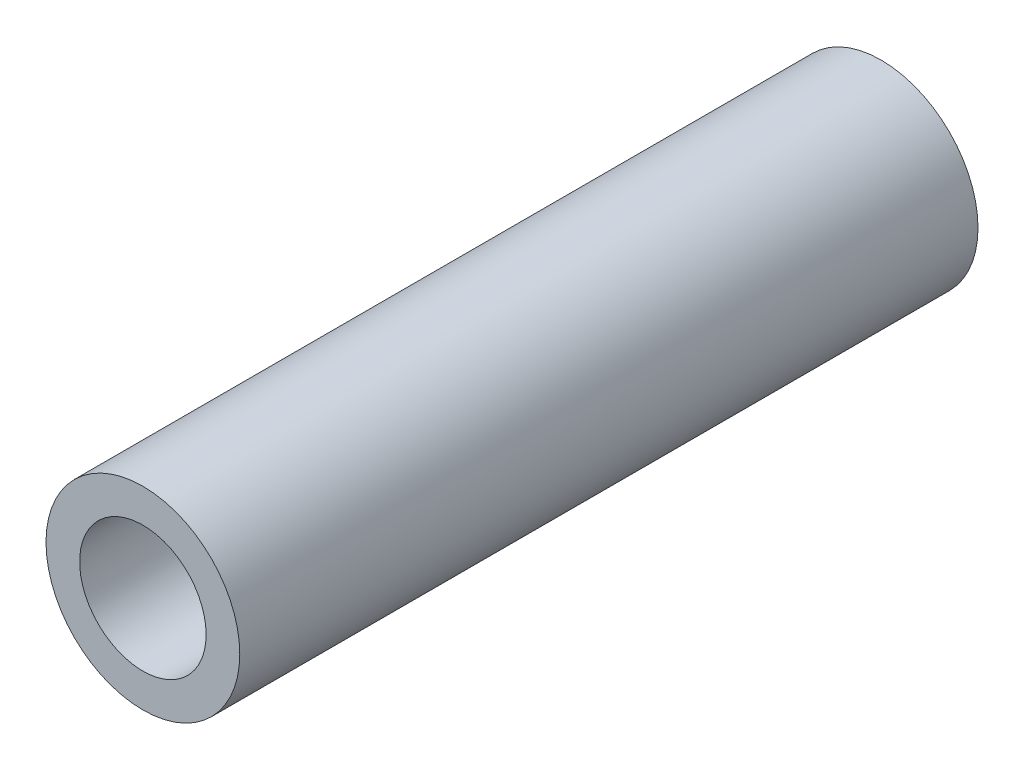
ISO-10303-21;
HEADER;
FILE_DESCRIPTION(('STEP AP214'),'2;1');
FILE_NAME('part.step','',(''),(''),'','','');
FILE_SCHEMA(('AUTOMOTIVE_DESIGN { 1 0 10303 214 1 1 1 1 }'));
ENDSEC;
DATA;
#1=APPLICATION_CONTEXT('core data for automotive mechanical design processes');
#2=APPLICATION_PROTOCOL_DEFINITION('international standard','automotive_design',2000,#1);
#3=PRODUCT_CONTEXT('',#1,'mechanical');
#4=PRODUCT('Part','Part','',(#3));
#5=PRODUCT_RELATED_PRODUCT_CATEGORY('part','',(#4));
#6=PRODUCT_DEFINITION_FORMATION('','',#4);
#7=PRODUCT_DEFINITION_CONTEXT('part definition',#1,'design');
#8=PRODUCT_DEFINITION('design','',#6,#7);
#9=PRODUCT_DEFINITION_SHAPE('','',#8);
#10=(LENGTH_UNIT() NAMED_UNIT(*) SI_UNIT(.MILLI.,.METRE.));
#11=(NAMED_UNIT(*) PLANE_ANGLE_UNIT() SI_UNIT($,.RADIAN.));
#12=(NAMED_UNIT(*) SI_UNIT($,.STERADIAN.) SOLID_ANGLE_UNIT());
#13=UNCERTAINTY_MEASURE_WITH_UNIT(LENGTH_MEASURE(1.E-05),#10,'distance_accuracy_value','');
#14=(GEOMETRIC_REPRESENTATION_CONTEXT(3) GLOBAL_UNCERTAINTY_ASSIGNED_CONTEXT((#13)) GLOBAL_UNIT_ASSIGNED_CONTEXT((#10,
#11,#12)) REPRESENTATION_CONTEXT('',''));
#15=CARTESIAN_POINT('',(0.,0.,0.));
#16=DIRECTION('',(0.,0.,1.));
#17=DIRECTION('',(1.,0.,0.));
#18=AXIS2_PLACEMENT_3D('',#15,#16,#17);
#19=CARTESIAN_POINT('',(0.,0.,19.05));
#20=DIRECTION('',(0.,0.,-1.));
#21=DIRECTION('',(-1.,0.,0.));
#22=AXIS2_PLACEMENT_3D('',#19,#20,#21);
#23=CYLINDRICAL_SURFACE('',#22,2.5);
#24=CARTESIAN_POINT('',(0.,0.,19.05));
#25=DIRECTION('',(0.,0.,1.));
#26=DIRECTION('',(1.,0.,0.));
#27=AXIS2_PLACEMENT_3D('',#24,#25,#26);
#28=CIRCLE('',#27,2.5);
#29=CARTESIAN_POINT('',(-2.5,0.,19.05));
#30=VERTEX_POINT('',#29);
#31=EDGE_CURVE('E10',#30,#30,#28,.T.);
#32=CARTESIAN_POINT('',(0.,0.,0.));
#33=DIRECTION('',(0.,0.,1.));
#34=DIRECTION('',(1.,0.,0.));
#35=AXIS2_PLACEMENT_3D('',#32,#33,#34);
#36=CIRCLE('',#35,2.5);
#37=CARTESIAN_POINT('',(-2.5,0.,0.));
#38=VERTEX_POINT('',#37);
#39=EDGE_CURVE('E36',#38,#38,#36,.T.);
#40=CARTESIAN_POINT('',(-2.5,0.,19.05));
#41=CARTESIAN_POINT('',(-2.5,0.,18.8515625));
#42=CARTESIAN_POINT('',(-2.5,0.,18.653125));
#43=CARTESIAN_POINT('',(-2.5,0.,18.25625));
#44=CARTESIAN_POINT('',(-2.5,0.,18.0578125));
#45=CARTESIAN_POINT('',(-2.5,0.,17.6609375));
#46=CARTESIAN_POINT('',(-2.5,0.,17.4625));
#47=CARTESIAN_POINT('',(-2.5,0.,17.065625));
#48=CARTESIAN_POINT('',(-2.5,0.,16.8671875));
#49=CARTESIAN_POINT('',(-2.5,0.,16.4703125));
#50=CARTESIAN_POINT('',(-2.5,0.,16.271875));
#51=CARTESIAN_POINT('',(-2.5,0.,15.875));
#52=CARTESIAN_POINT('',(-2.5,0.,15.6765625));
#53=CARTESIAN_POINT('',(-2.5,0.,15.2796875));
#54=CARTESIAN_POINT('',(-2.5,0.,15.08125));
#55=CARTESIAN_POINT('',(-2.5,0.,14.684375));
#56=CARTESIAN_POINT('',(-2.5,0.,14.4859375));
#57=CARTESIAN_POINT('',(-2.5,0.,14.0890625));
#58=CARTESIAN_POINT('',(-2.5,0.,13.890625));
#59=CARTESIAN_POINT('',(-2.5,0.,13.49375));
#60=CARTESIAN_POINT('',(-2.5,0.,13.2953125));
#61=CARTESIAN_POINT('',(-2.5,0.,12.8984375));
#62=CARTESIAN_POINT('',(-2.5,0.,12.7));
#63=CARTESIAN_POINT('',(-2.5,0.,12.303125));
#64=CARTESIAN_POINT('',(-2.5,0.,12.1046875));
#65=CARTESIAN_POINT('',(-2.5,0.,11.7078125));
#66=CARTESIAN_POINT('',(-2.5,0.,11.509375));
#67=CARTESIAN_POINT('',(-2.5,0.,11.1125));
#68=CARTESIAN_POINT('',(-2.5,0.,10.9140625));
#69=CARTESIAN_POINT('',(-2.5,0.,10.5171875));
#70=CARTESIAN_POINT('',(-2.5,0.,10.31875));
#71=CARTESIAN_POINT('',(-2.5,0.,9.921875));
#72=CARTESIAN_POINT('',(-2.5,0.,9.7234375));
#73=CARTESIAN_POINT('',(-2.5,0.,9.3265625));
#74=CARTESIAN_POINT('',(-2.5,0.,9.128125));
#75=CARTESIAN_POINT('',(-2.5,0.,8.73125));
#76=CARTESIAN_POINT('',(-2.5,0.,8.5328125));
#77=CARTESIAN_POINT('',(-2.5,0.,8.1359375));
#78=CARTESIAN_POINT('',(-2.5,0.,7.9375));
#79=CARTESIAN_POINT('',(-2.5,0.,7.540625));
#80=CARTESIAN_POINT('',(-2.5,0.,7.3421875));
#81=CARTESIAN_POINT('',(-2.5,0.,6.9453125));
#82=CARTESIAN_POINT('',(-2.5,0.,6.746875));
#83=CARTESIAN_POINT('',(-2.5,0.,6.35));
#84=CARTESIAN_POINT('',(-2.5,0.,6.1515625));
#85=CARTESIAN_POINT('',(-2.5,0.,5.7546875));
#86=CARTESIAN_POINT('',(-2.5,0.,5.55625));
#87=CARTESIAN_POINT('',(-2.5,0.,5.159375));
#88=CARTESIAN_POINT('',(-2.5,0.,4.9609375));
#89=CARTESIAN_POINT('',(-2.5,0.,4.5640625));
#90=CARTESIAN_POINT('',(-2.5,0.,4.365625));
#91=CARTESIAN_POINT('',(-2.5,0.,3.96875));
#92=CARTESIAN_POINT('',(-2.5,0.,3.7703125));
#93=CARTESIAN_POINT('',(-2.5,0.,3.3734375));
#94=CARTESIAN_POINT('',(-2.5,0.,3.175));
#95=CARTESIAN_POINT('',(-2.5,0.,2.778125));
#96=CARTESIAN_POINT('',(-2.5,0.,2.5796875));
#97=CARTESIAN_POINT('',(-2.5,0.,2.1828125));
#98=CARTESIAN_POINT('',(-2.5,0.,1.984375));
#99=CARTESIAN_POINT('',(-2.5,0.,1.5875));
#100=CARTESIAN_POINT('',(-2.5,0.,1.3890625));
#101=CARTESIAN_POINT('',(-2.5,0.,0.992187500000001));
#102=CARTESIAN_POINT('',(-2.5,0.,0.793750000000001));
#103=CARTESIAN_POINT('',(-2.5,0.,0.396875));
#104=CARTESIAN_POINT('',(-2.5,0.,0.1984375));
#105=CARTESIAN_POINT('',(-2.5,0.,0.));
#106=B_SPLINE_CURVE_WITH_KNOTS('',3,(#40,#41,#42,#43,#44,#45,#46,#47,#48,#49,#50,#51,#52,#53,
#54,#55,#56,#57,#58,#59,#60,#61,#62,#63,#64,#65,#66,#67,#68,#69,#70,#71,#72,#73,#74,#75,#76,#77,
#78,#79,#80,#81,#82,#83,#84,#85,#86,#87,#88,#89,#90,#91,#92,#93,#94,#95,#96,#97,#98,#99,#100,
#101,#102,#103,#104,#105),.UNSPECIFIED.,.F.,.F.,(4,2,2,2,2,2,2,2,2,2,2,2,2,2,2,2,2,2,2,2,2,2,2,
2,2,2,2,2,2,2,2,2,4),(0.,0.5953125,1.190625,1.7859375,2.38125,2.9765625,3.571875,4.1671875,
4.7625,5.3578125,5.953125,6.5484375,7.14375,7.7390625,8.334375,8.9296875,9.525,10.1203125,
10.715625,11.3109375,11.90625,12.5015625,13.096875,13.6921875,14.2875,14.8828125,15.478125,
16.0734375,16.66875,17.2640625,17.859375,18.4546875,19.05),.UNSPECIFIED.);
#107=EDGE_CURVE('BSEAM33',#30,#38,#106,.T.);
#108=ORIENTED_EDGE('',*,*,#31,.F.);
#109=ORIENTED_EDGE('',*,*,#39,.T.);
#110=ORIENTED_EDGE('',*,*,#107,.T.);
#111=ORIENTED_EDGE('',*,*,#107,.F.);
#112=EDGE_LOOP('',(#108,#110,#109,#111));
#113=FACE_BOUND('',#112,.T.);
#114=ADVANCED_FACE('F33',(#113),#23,.T.);
#115=CARTESIAN_POINT('',(0.,0.,19.05));
#116=DIRECTION('',(0.,0.,1.));
#117=DIRECTION('',(1.,0.,0.));
#118=AXIS2_PLACEMENT_3D('',#115,#116,#117);
#119=PLANE('',#118);
#120=CARTESIAN_POINT('',(0.,0.,19.05));
#121=DIRECTION('',(0.,0.,1.));
#122=DIRECTION('',(1.,0.,0.));
#123=AXIS2_PLACEMENT_3D('',#120,#121,#122);
#124=CIRCLE('',#123,1.63195);
#125=CARTESIAN_POINT('',(1.63195,0.,19.05));
#126=VERTEX_POINT('',#125);
#127=EDGE_CURVE('E47',#126,#126,#124,.T.);
#128=ORIENTED_EDGE('',*,*,#127,.F.);
#129=EDGE_LOOP('',(#128));
#130=FACE_BOUND('',#129,.T.);
#131=ORIENTED_EDGE('',*,*,#31,.T.);
#132=EDGE_LOOP('',(#131));
#133=FACE_BOUND('',#132,.T.);
#134=ADVANCED_FACE('F53',(#130,#133),#119,.T.);
#135=CARTESIAN_POINT('',(0.,0.,0.));
#136=DIRECTION('',(0.,0.,1.));
#137=DIRECTION('',(1.,0.,0.));
#138=AXIS2_PLACEMENT_3D('',#135,#136,#137);
#139=PLANE('',#138);
#140=CARTESIAN_POINT('',(0.,0.,0.));
#141=DIRECTION('',(0.,0.,1.));
#142=DIRECTION('',(1.,0.,0.));
#143=AXIS2_PLACEMENT_3D('',#140,#141,#142);
#144=CIRCLE('',#143,1.63195);
#145=CARTESIAN_POINT('',(1.63195,0.,0.));
#146=VERTEX_POINT('',#145);
#147=EDGE_CURVE('E43',#146,#146,#144,.T.);
#148=ORIENTED_EDGE('',*,*,#147,.T.);
#149=EDGE_LOOP('',(#148));
#150=FACE_BOUND('',#149,.T.);
#151=ORIENTED_EDGE('',*,*,#39,.F.);
#152=EDGE_LOOP('',(#151));
#153=FACE_BOUND('',#152,.T.);
#154=ADVANCED_FACE('F55',(#150,#153),#139,.F.);
#155=CARTESIAN_POINT('',(0.,0.,19.05));
#156=DIRECTION('',(0.,0.,1.));
#157=DIRECTION('',(1.,0.,0.));
#158=AXIS2_PLACEMENT_3D('',#155,#156,#157);
#159=CYLINDRICAL_SURFACE('',#158,1.63195);
#160=ORIENTED_EDGE('',*,*,#147,.F.);
#161=EDGE_LOOP('',(#160));
#162=FACE_BOUND('',#161,.T.);
#163=ORIENTED_EDGE('',*,*,#127,.T.);
#164=EDGE_LOOP('',(#163));
#165=FACE_BOUND('',#164,.T.);
#166=ADVANCED_FACE('F51',(#162,#165),#159,.F.);
#167=CLOSED_SHELL('',(#114,#134,#154,#166));
#168=MANIFOLD_SOLID_BREP('B2',#167);
#169=ADVANCED_BREP_SHAPE_REPRESENTATION('',(#18,#168),#14);
#170=SHAPE_DEFINITION_REPRESENTATION(#9,#169);
ENDSEC;
END-ISO-10303-21;
